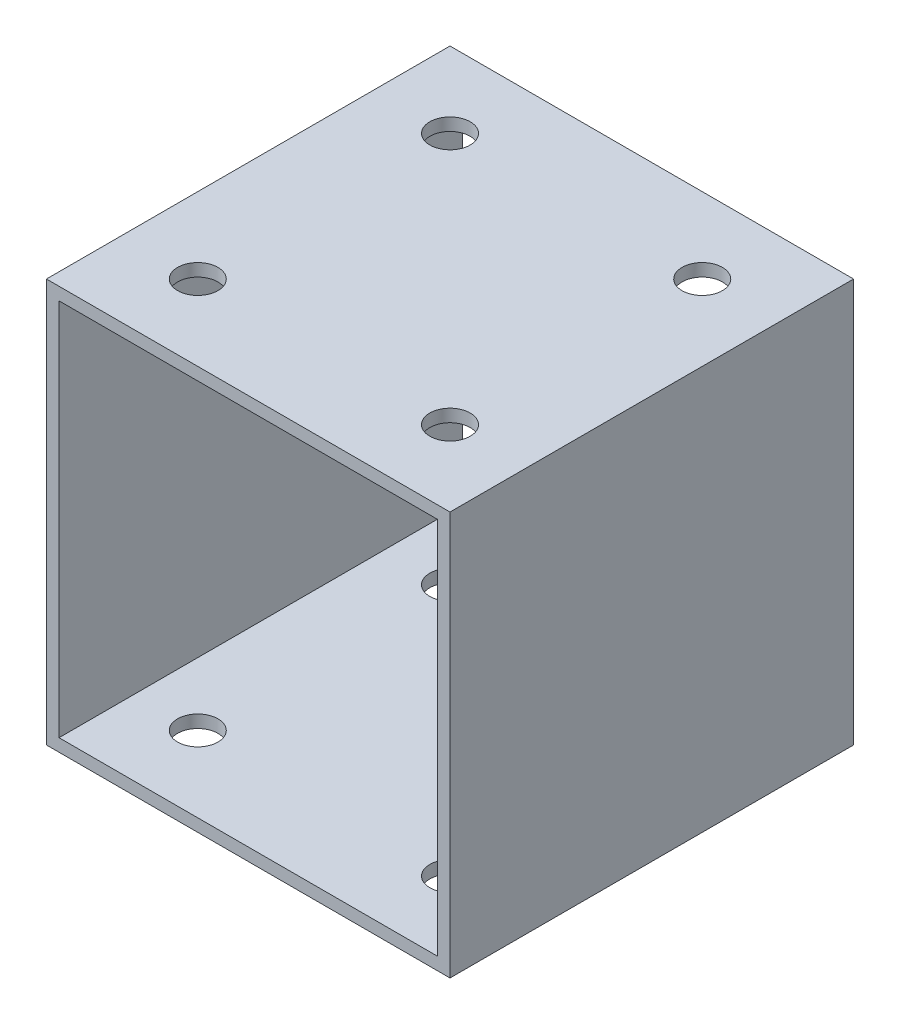
ISO-10303-21;
HEADER;
FILE_DESCRIPTION(('STEP AP214'),'2;1');
FILE_NAME('part.step','',(''),(''),'','','');
FILE_SCHEMA(('AUTOMOTIVE_DESIGN { 1 0 10303 214 1 1 1 1 }'));
ENDSEC;
DATA;
#1=APPLICATION_CONTEXT('core data for automotive mechanical design processes');
#2=APPLICATION_PROTOCOL_DEFINITION('international standard','automotive_design',2000,#1);
#3=PRODUCT_CONTEXT('',#1,'mechanical');
#4=PRODUCT('Part','Part','',(#3));
#5=PRODUCT_RELATED_PRODUCT_CATEGORY('part','',(#4));
#6=PRODUCT_DEFINITION_FORMATION('','',#4);
#7=PRODUCT_DEFINITION_CONTEXT('part definition',#1,'design');
#8=PRODUCT_DEFINITION('design','',#6,#7);
#9=PRODUCT_DEFINITION_SHAPE('','',#8);
#10=(LENGTH_UNIT() NAMED_UNIT(*) SI_UNIT(.MILLI.,.METRE.));
#11=(NAMED_UNIT(*) PLANE_ANGLE_UNIT() SI_UNIT($,.RADIAN.));
#12=(NAMED_UNIT(*) SI_UNIT($,.STERADIAN.) SOLID_ANGLE_UNIT());
#13=UNCERTAINTY_MEASURE_WITH_UNIT(LENGTH_MEASURE(1.E-05),#10,'distance_accuracy_value','');
#14=(GEOMETRIC_REPRESENTATION_CONTEXT(3) GLOBAL_UNCERTAINTY_ASSIGNED_CONTEXT((#13)) GLOBAL_UNIT_ASSIGNED_CONTEXT((#10,
#11,#12)) REPRESENTATION_CONTEXT('',''));
#15=CARTESIAN_POINT('',(0.,0.,0.));
#16=DIRECTION('',(0.,0.,1.));
#17=DIRECTION('',(1.,0.,0.));
#18=AXIS2_PLACEMENT_3D('',#15,#16,#17);
#19=CARTESIAN_POINT('',(0.,0.,50.8));
#20=DIRECTION('',(0.,0.,-1.));
#21=DIRECTION('',(-1.,0.,0.));
#22=AXIS2_PLACEMENT_3D('',#19,#20,#21);
#23=PLANE('',#22);
#24=DIRECTION('',(0.,-1.,0.));
#25=VECTOR('',#24,1.);
#26=CARTESIAN_POINT('',(0.,0.,50.8));
#27=LINE('',#26,#25);
#28=CARTESIAN_POINT('',(0.,50.8,50.8));
#29=VERTEX_POINT('',#28);
#30=CARTESIAN_POINT('',(0.,0.,50.8));
#31=VERTEX_POINT('',#30);
#32=EDGE_CURVE('E139',#29,#31,#27,.T.);
#33=ORIENTED_EDGE('',*,*,#32,.T.);
#34=DIRECTION('',(1.,0.,0.));
#35=VECTOR('',#34,1.);
#36=CARTESIAN_POINT('',(0.,0.,50.8));
#37=LINE('',#36,#35);
#38=CARTESIAN_POINT('',(50.8,0.,50.8));
#39=VERTEX_POINT('',#38);
#40=EDGE_CURVE('E142',#31,#39,#37,.T.);
#41=ORIENTED_EDGE('',*,*,#40,.T.);
#42=DIRECTION('',(0.,1.,0.));
#43=VECTOR('',#42,1.);
#44=CARTESIAN_POINT('',(50.8,0.,50.8));
#45=LINE('',#44,#43);
#46=CARTESIAN_POINT('',(50.8,50.8,50.8));
#47=VERTEX_POINT('',#46);
#48=EDGE_CURVE('E145',#39,#47,#45,.T.);
#49=ORIENTED_EDGE('',*,*,#48,.T.);
#50=DIRECTION('',(-1.,0.,0.));
#51=VECTOR('',#50,1.);
#52=CARTESIAN_POINT('',(0.,50.8,50.8));
#53=LINE('',#52,#51);
#54=EDGE_CURVE('E147',#47,#29,#53,.T.);
#55=ORIENTED_EDGE('',*,*,#54,.T.);
#56=EDGE_LOOP('',(#33,#41,#49,#55));
#57=FACE_BOUND('',#56,.T.);
#58=DIRECTION('',(0.,-1.,0.));
#59=VECTOR('',#58,1.);
#60=CARTESIAN_POINT('',(1.5875,1.5875,50.8));
#61=LINE('',#60,#59);
#62=CARTESIAN_POINT('',(1.5875,49.2125,50.8));
#63=VERTEX_POINT('',#62);
#64=CARTESIAN_POINT('',(1.5875,1.5875,50.8));
#65=VERTEX_POINT('',#64);
#66=EDGE_CURVE('E101',#63,#65,#61,.T.);
#67=ORIENTED_EDGE('',*,*,#66,.F.);
#68=DIRECTION('',(-1.,0.,0.));
#69=VECTOR('',#68,1.);
#70=CARTESIAN_POINT('',(1.5875,49.2125,50.8));
#71=LINE('',#70,#69);
#72=CARTESIAN_POINT('',(49.2125,49.2125,50.8));
#73=VERTEX_POINT('',#72);
#74=EDGE_CURVE('E123',#73,#63,#71,.T.);
#75=ORIENTED_EDGE('',*,*,#74,.F.);
#76=DIRECTION('',(0.,1.,0.));
#77=VECTOR('',#76,1.);
#78=CARTESIAN_POINT('',(49.2125,1.5875,50.8));
#79=LINE('',#78,#77);
#80=CARTESIAN_POINT('',(49.2125,1.5875,50.8));
#81=VERTEX_POINT('',#80);
#82=EDGE_CURVE('E121',#81,#73,#79,.T.);
#83=ORIENTED_EDGE('',*,*,#82,.F.);
#84=DIRECTION('',(1.,0.,0.));
#85=VECTOR('',#84,1.);
#86=CARTESIAN_POINT('',(1.5875,1.5875,50.8));
#87=LINE('',#86,#85);
#88=EDGE_CURVE('E109',#65,#81,#87,.T.);
#89=ORIENTED_EDGE('',*,*,#88,.F.);
#90=EDGE_LOOP('',(#67,#75,#83,#89));
#91=FACE_BOUND('',#90,.T.);
#92=ADVANCED_FACE('F34',(#57,#91),#23,.F.);
#93=CARTESIAN_POINT('',(0.,0.,0.));
#94=DIRECTION('',(0.,0.,-1.));
#95=DIRECTION('',(-1.,0.,0.));
#96=AXIS2_PLACEMENT_3D('',#93,#94,#95);
#97=PLANE('',#96);
#98=DIRECTION('',(0.,-1.,0.));
#99=VECTOR('',#98,1.);
#100=CARTESIAN_POINT('',(0.,0.,0.));
#101=LINE('',#100,#99);
#102=CARTESIAN_POINT('',(0.,50.8,0.));
#103=VERTEX_POINT('',#102);
#104=CARTESIAN_POINT('',(0.,0.,0.));
#105=VERTEX_POINT('',#104);
#106=EDGE_CURVE('E117',#103,#105,#101,.T.);
#107=ORIENTED_EDGE('',*,*,#106,.F.);
#108=DIRECTION('',(-1.,0.,0.));
#109=VECTOR('',#108,1.);
#110=CARTESIAN_POINT('',(0.,50.8,0.));
#111=LINE('',#110,#109);
#112=CARTESIAN_POINT('',(50.8,50.8,0.));
#113=VERTEX_POINT('',#112);
#114=EDGE_CURVE('E143',#113,#103,#111,.T.);
#115=ORIENTED_EDGE('',*,*,#114,.F.);
#116=DIRECTION('',(0.,1.,0.));
#117=VECTOR('',#116,1.);
#118=CARTESIAN_POINT('',(50.8,0.,0.));
#119=LINE('',#118,#117);
#120=CARTESIAN_POINT('',(50.8,0.,0.));
#121=VERTEX_POINT('',#120);
#122=EDGE_CURVE('E154',#121,#113,#119,.T.);
#123=ORIENTED_EDGE('',*,*,#122,.F.);
#124=DIRECTION('',(1.,0.,0.));
#125=VECTOR('',#124,1.);
#126=CARTESIAN_POINT('',(0.,0.,0.));
#127=LINE('',#126,#125);
#128=EDGE_CURVE('E152',#105,#121,#127,.T.);
#129=ORIENTED_EDGE('',*,*,#128,.F.);
#130=EDGE_LOOP('',(#107,#115,#123,#129));
#131=FACE_BOUND('',#130,.T.);
#132=DIRECTION('',(-1.,0.,0.));
#133=VECTOR('',#132,1.);
#134=CARTESIAN_POINT('',(1.5875,49.2125,0.));
#135=LINE('',#134,#133);
#136=CARTESIAN_POINT('',(49.2125,49.2125,0.));
#137=VERTEX_POINT('',#136);
#138=CARTESIAN_POINT('',(1.5875,49.2125,0.));
#139=VERTEX_POINT('',#138);
#140=EDGE_CURVE('E110',#137,#139,#135,.T.);
#141=ORIENTED_EDGE('',*,*,#140,.T.);
#142=DIRECTION('',(0.,-1.,0.));
#143=VECTOR('',#142,1.);
#144=CARTESIAN_POINT('',(1.5875,1.5875,0.));
#145=LINE('',#144,#143);
#146=CARTESIAN_POINT('',(1.5875,1.5875,0.));
#147=VERTEX_POINT('',#146);
#148=EDGE_CURVE('E59',#139,#147,#145,.T.);
#149=ORIENTED_EDGE('',*,*,#148,.T.);
#150=DIRECTION('',(1.,0.,0.));
#151=VECTOR('',#150,1.);
#152=CARTESIAN_POINT('',(1.5875,1.5875,0.));
#153=LINE('',#152,#151);
#154=CARTESIAN_POINT('',(49.2125,1.5875,0.));
#155=VERTEX_POINT('',#154);
#156=EDGE_CURVE('E116',#147,#155,#153,.T.);
#157=ORIENTED_EDGE('',*,*,#156,.T.);
#158=DIRECTION('',(0.,1.,0.));
#159=VECTOR('',#158,1.);
#160=CARTESIAN_POINT('',(49.2125,1.5875,0.));
#161=LINE('',#160,#159);
#162=EDGE_CURVE('E131',#155,#137,#161,.T.);
#163=ORIENTED_EDGE('',*,*,#162,.T.);
#164=EDGE_LOOP('',(#141,#149,#157,#163));
#165=FACE_BOUND('',#164,.T.);
#166=ADVANCED_FACE('F206',(#131,#165),#97,.T.);
#167=CARTESIAN_POINT('',(0.,0.,50.8));
#168=DIRECTION('',(1.,0.,0.));
#169=DIRECTION('',(0.,0.,-1.));
#170=AXIS2_PLACEMENT_3D('',#167,#168,#169);
#171=PLANE('',#170);
#172=ORIENTED_EDGE('',*,*,#106,.T.);
#173=DIRECTION('',(0.,0.,-1.));
#174=VECTOR('',#173,1.);
#175=CARTESIAN_POINT('',(0.,0.,50.8));
#176=LINE('',#175,#174);
#177=EDGE_CURVE('E11',#31,#105,#176,.T.);
#178=ORIENTED_EDGE('',*,*,#177,.F.);
#179=ORIENTED_EDGE('',*,*,#32,.F.);
#180=DIRECTION('',(0.,0.,-1.));
#181=VECTOR('',#180,1.);
#182=CARTESIAN_POINT('',(0.,50.8,50.8));
#183=LINE('',#182,#181);
#184=EDGE_CURVE('E149',#29,#103,#183,.T.);
#185=ORIENTED_EDGE('',*,*,#184,.T.);
#186=EDGE_LOOP('',(#172,#178,#179,#185));
#187=FACE_BOUND('',#186,.T.);
#188=ADVANCED_FACE('F36',(#187),#171,.F.);
#189=CARTESIAN_POINT('',(0.,0.,50.8));
#190=DIRECTION('',(0.,1.,0.));
#191=DIRECTION('',(0.,0.,1.));
#192=AXIS2_PLACEMENT_3D('',#189,#190,#191);
#193=PLANE('',#192);
#194=CARTESIAN_POINT('',(41.275,0.,41.275));
#195=DIRECTION('',(0.,1.,0.));
#196=DIRECTION('',(0.,0.,1.));
#197=AXIS2_PLACEMENT_3D('',#194,#195,#196);
#198=CIRCLE('',#197,2.54);
#199=CARTESIAN_POINT('',(41.275,0.,43.815));
#200=VERTEX_POINT('',#199);
#201=EDGE_CURVE('E242',#200,#200,#198,.T.);
#202=ORIENTED_EDGE('',*,*,#201,.T.);
#203=EDGE_LOOP('',(#202));
#204=FACE_BOUND('',#203,.T.);
#205=CARTESIAN_POINT('',(9.525,0.,9.525));
#206=DIRECTION('',(0.,1.,0.));
#207=DIRECTION('',(0.,0.,1.));
#208=AXIS2_PLACEMENT_3D('',#205,#206,#207);
#209=CIRCLE('',#208,2.54);
#210=CARTESIAN_POINT('',(9.525,0.,12.065));
#211=VERTEX_POINT('',#210);
#212=EDGE_CURVE('E246',#211,#211,#209,.T.);
#213=ORIENTED_EDGE('',*,*,#212,.T.);
#214=EDGE_LOOP('',(#213));
#215=FACE_BOUND('',#214,.T.);
#216=CARTESIAN_POINT('',(9.525,0.,41.275));
#217=DIRECTION('',(0.,1.,0.));
#218=DIRECTION('',(0.,0.,1.));
#219=AXIS2_PLACEMENT_3D('',#216,#217,#218);
#220=CIRCLE('',#219,2.54);
#221=CARTESIAN_POINT('',(9.525,0.,43.815));
#222=VERTEX_POINT('',#221);
#223=EDGE_CURVE('E250',#222,#222,#220,.T.);
#224=ORIENTED_EDGE('',*,*,#223,.T.);
#225=EDGE_LOOP('',(#224));
#226=FACE_BOUND('',#225,.T.);
#227=CARTESIAN_POINT('',(41.275,0.,9.525));
#228=DIRECTION('',(0.,1.,0.));
#229=DIRECTION('',(0.,0.,1.));
#230=AXIS2_PLACEMENT_3D('',#227,#228,#229);
#231=CIRCLE('',#230,2.54);
#232=CARTESIAN_POINT('',(41.275,0.,12.065));
#233=VERTEX_POINT('',#232);
#234=EDGE_CURVE('E168',#233,#233,#231,.T.);
#235=ORIENTED_EDGE('',*,*,#234,.T.);
#236=EDGE_LOOP('',(#235));
#237=FACE_BOUND('',#236,.T.);
#238=ORIENTED_EDGE('',*,*,#128,.T.);
#239=DIRECTION('',(0.,0.,-1.));
#240=VECTOR('',#239,1.);
#241=CARTESIAN_POINT('',(50.8,0.,50.8));
#242=LINE('',#241,#240);
#243=EDGE_CURVE('E43',#39,#121,#242,.T.);
#244=ORIENTED_EDGE('',*,*,#243,.F.);
#245=ORIENTED_EDGE('',*,*,#40,.F.);
#246=ORIENTED_EDGE('',*,*,#177,.T.);
#247=EDGE_LOOP('',(#238,#244,#245,#246));
#248=FACE_BOUND('',#247,.T.);
#249=ADVANCED_FACE('F231',(#204,#215,#226,#237,#248),#193,.F.);
#250=CARTESIAN_POINT('',(50.8,0.,50.8));
#251=DIRECTION('',(-1.,0.,0.));
#252=DIRECTION('',(0.,0.,1.));
#253=AXIS2_PLACEMENT_3D('',#250,#251,#252);
#254=PLANE('',#253);
#255=ORIENTED_EDGE('',*,*,#122,.T.);
#256=DIRECTION('',(0.,0.,-1.));
#257=VECTOR('',#256,1.);
#258=CARTESIAN_POINT('',(50.8,50.8,50.8));
#259=LINE('',#258,#257);
#260=EDGE_CURVE('E159',#47,#113,#259,.T.);
#261=ORIENTED_EDGE('',*,*,#260,.F.);
#262=ORIENTED_EDGE('',*,*,#48,.F.);
#263=ORIENTED_EDGE('',*,*,#243,.T.);
#264=EDGE_LOOP('',(#255,#261,#262,#263));
#265=FACE_BOUND('',#264,.T.);
#266=ADVANCED_FACE('F228',(#265),#254,.F.);
#267=CARTESIAN_POINT('',(0.,50.8,50.8));
#268=DIRECTION('',(0.,-1.,0.));
#269=DIRECTION('',(0.,0.,-1.));
#270=AXIS2_PLACEMENT_3D('',#267,#268,#269);
#271=PLANE('',#270);
#272=CARTESIAN_POINT('',(41.275,50.8,41.275));
#273=DIRECTION('',(0.,1.,0.));
#274=DIRECTION('',(0.,0.,1.));
#275=AXIS2_PLACEMENT_3D('',#272,#273,#274);
#276=CIRCLE('',#275,2.54);
#277=CARTESIAN_POINT('',(41.275,50.8,43.815));
#278=VERTEX_POINT('',#277);
#279=EDGE_CURVE('E274',#278,#278,#276,.T.);
#280=ORIENTED_EDGE('',*,*,#279,.F.);
#281=EDGE_LOOP('',(#280));
#282=FACE_BOUND('',#281,.T.);
#283=CARTESIAN_POINT('',(9.525,50.8,9.525));
#284=DIRECTION('',(0.,1.,0.));
#285=DIRECTION('',(0.,0.,1.));
#286=AXIS2_PLACEMENT_3D('',#283,#284,#285);
#287=CIRCLE('',#286,2.54);
#288=CARTESIAN_POINT('',(9.525,50.8,12.065));
#289=VERTEX_POINT('',#288);
#290=EDGE_CURVE('E270',#289,#289,#287,.T.);
#291=ORIENTED_EDGE('',*,*,#290,.F.);
#292=EDGE_LOOP('',(#291));
#293=FACE_BOUND('',#292,.T.);
#294=CARTESIAN_POINT('',(9.525,50.8,41.275));
#295=DIRECTION('',(0.,1.,0.));
#296=DIRECTION('',(0.,0.,1.));
#297=AXIS2_PLACEMENT_3D('',#294,#295,#296);
#298=CIRCLE('',#297,2.54);
#299=CARTESIAN_POINT('',(9.525,50.8,43.815));
#300=VERTEX_POINT('',#299);
#301=EDGE_CURVE('E278',#300,#300,#298,.T.);
#302=ORIENTED_EDGE('',*,*,#301,.F.);
#303=EDGE_LOOP('',(#302));
#304=FACE_BOUND('',#303,.T.);
#305=CARTESIAN_POINT('',(41.275,50.8,9.525));
#306=DIRECTION('',(0.,1.,0.));
#307=DIRECTION('',(0.,0.,1.));
#308=AXIS2_PLACEMENT_3D('',#305,#306,#307);
#309=CIRCLE('',#308,2.54);
#310=CARTESIAN_POINT('',(41.275,50.8,12.065));
#311=VERTEX_POINT('',#310);
#312=EDGE_CURVE('E266',#311,#311,#309,.T.);
#313=ORIENTED_EDGE('',*,*,#312,.F.);
#314=EDGE_LOOP('',(#313));
#315=FACE_BOUND('',#314,.T.);
#316=ORIENTED_EDGE('',*,*,#114,.T.);
#317=ORIENTED_EDGE('',*,*,#184,.F.);
#318=ORIENTED_EDGE('',*,*,#54,.F.);
#319=ORIENTED_EDGE('',*,*,#260,.T.);
#320=EDGE_LOOP('',(#316,#317,#318,#319));
#321=FACE_BOUND('',#320,.T.);
#322=ADVANCED_FACE('F225',(#282,#293,#304,#315,#321),#271,.F.);
#323=CARTESIAN_POINT('',(1.5875,1.5875,50.8));
#324=DIRECTION('',(1.,0.,0.));
#325=DIRECTION('',(0.,0.,-1.));
#326=AXIS2_PLACEMENT_3D('',#323,#324,#325);
#327=PLANE('',#326);
#328=ORIENTED_EDGE('',*,*,#148,.F.);
#329=DIRECTION('',(0.,0.,-1.));
#330=VECTOR('',#329,1.);
#331=CARTESIAN_POINT('',(1.5875,49.2125,50.8));
#332=LINE('',#331,#330);
#333=EDGE_CURVE('E105',#63,#139,#332,.T.);
#334=ORIENTED_EDGE('',*,*,#333,.F.);
#335=ORIENTED_EDGE('',*,*,#66,.T.);
#336=DIRECTION('',(0.,0.,-1.));
#337=VECTOR('',#336,1.);
#338=CARTESIAN_POINT('',(1.5875,1.5875,50.8));
#339=LINE('',#338,#337);
#340=EDGE_CURVE('E104',#65,#147,#339,.T.);
#341=ORIENTED_EDGE('',*,*,#340,.T.);
#342=EDGE_LOOP('',(#328,#334,#335,#341));
#343=FACE_BOUND('',#342,.T.);
#344=ADVANCED_FACE('F103',(#343),#327,.T.);
#345=CARTESIAN_POINT('',(1.5875,1.5875,50.8));
#346=DIRECTION('',(0.,1.,0.));
#347=DIRECTION('',(0.,0.,1.));
#348=AXIS2_PLACEMENT_3D('',#345,#346,#347);
#349=PLANE('',#348);
#350=CARTESIAN_POINT('',(41.275,1.5875,41.275));
#351=DIRECTION('',(0.,1.,0.));
#352=DIRECTION('',(0.,0.,1.));
#353=AXIS2_PLACEMENT_3D('',#350,#351,#352);
#354=CIRCLE('',#353,2.54);
#355=CARTESIAN_POINT('',(41.275,1.5875,43.815));
#356=VERTEX_POINT('',#355);
#357=EDGE_CURVE('E129',#356,#356,#354,.T.);
#358=ORIENTED_EDGE('',*,*,#357,.F.);
#359=EDGE_LOOP('',(#358));
#360=FACE_BOUND('',#359,.T.);
#361=CARTESIAN_POINT('',(9.525,1.5875,9.525));
#362=DIRECTION('',(0.,1.,0.));
#363=DIRECTION('',(0.,0.,1.));
#364=AXIS2_PLACEMENT_3D('',#361,#362,#363);
#365=CIRCLE('',#364,2.54);
#366=CARTESIAN_POINT('',(9.525,1.5875,12.065));
#367=VERTEX_POINT('',#366);
#368=EDGE_CURVE('E174',#367,#367,#365,.T.);
#369=ORIENTED_EDGE('',*,*,#368,.F.);
#370=EDGE_LOOP('',(#369));
#371=FACE_BOUND('',#370,.T.);
#372=CARTESIAN_POINT('',(9.525,1.5875,41.275));
#373=DIRECTION('',(0.,1.,0.));
#374=DIRECTION('',(0.,0.,1.));
#375=AXIS2_PLACEMENT_3D('',#372,#373,#374);
#376=CIRCLE('',#375,2.54);
#377=CARTESIAN_POINT('',(9.525,1.5875,43.815));
#378=VERTEX_POINT('',#377);
#379=EDGE_CURVE('E171',#378,#378,#376,.T.);
#380=ORIENTED_EDGE('',*,*,#379,.F.);
#381=EDGE_LOOP('',(#380));
#382=FACE_BOUND('',#381,.T.);
#383=CARTESIAN_POINT('',(41.275,1.5875,9.525));
#384=DIRECTION('',(0.,1.,0.));
#385=DIRECTION('',(0.,0.,1.));
#386=AXIS2_PLACEMENT_3D('',#383,#384,#385);
#387=CIRCLE('',#386,2.54);
#388=CARTESIAN_POINT('',(41.275,1.5875,12.065));
#389=VERTEX_POINT('',#388);
#390=EDGE_CURVE('E167',#389,#389,#387,.T.);
#391=ORIENTED_EDGE('',*,*,#390,.F.);
#392=EDGE_LOOP('',(#391));
#393=FACE_BOUND('',#392,.T.);
#394=ORIENTED_EDGE('',*,*,#156,.F.);
#395=ORIENTED_EDGE('',*,*,#340,.F.);
#396=ORIENTED_EDGE('',*,*,#88,.T.);
#397=DIRECTION('',(0.,0.,-1.));
#398=VECTOR('',#397,1.);
#399=CARTESIAN_POINT('',(49.2125,1.5875,50.8));
#400=LINE('',#399,#398);
#401=EDGE_CURVE('E118',#81,#155,#400,.T.);
#402=ORIENTED_EDGE('',*,*,#401,.T.);
#403=EDGE_LOOP('',(#394,#395,#396,#402));
#404=FACE_BOUND('',#403,.T.);
#405=ADVANCED_FACE('F113',(#360,#371,#382,#393,#404),#349,.T.);
#406=CARTESIAN_POINT('',(49.2125,1.5875,50.8));
#407=DIRECTION('',(-1.,0.,0.));
#408=DIRECTION('',(0.,0.,1.));
#409=AXIS2_PLACEMENT_3D('',#406,#407,#408);
#410=PLANE('',#409);
#411=ORIENTED_EDGE('',*,*,#162,.F.);
#412=ORIENTED_EDGE('',*,*,#401,.F.);
#413=ORIENTED_EDGE('',*,*,#82,.T.);
#414=DIRECTION('',(0.,0.,-1.));
#415=VECTOR('',#414,1.);
#416=CARTESIAN_POINT('',(49.2125,49.2125,50.8));
#417=LINE('',#416,#415);
#418=EDGE_CURVE('E51',#73,#137,#417,.T.);
#419=ORIENTED_EDGE('',*,*,#418,.T.);
#420=EDGE_LOOP('',(#411,#412,#413,#419));
#421=FACE_BOUND('',#420,.T.);
#422=ADVANCED_FACE('F198',(#421),#410,.T.);
#423=CARTESIAN_POINT('',(1.5875,49.2125,50.8));
#424=DIRECTION('',(0.,-1.,0.));
#425=DIRECTION('',(0.,0.,-1.));
#426=AXIS2_PLACEMENT_3D('',#423,#424,#425);
#427=PLANE('',#426);
#428=CARTESIAN_POINT('',(41.275,49.2125,41.275));
#429=DIRECTION('',(0.,-1.,0.));
#430=DIRECTION('',(0.,0.,-1.));
#431=AXIS2_PLACEMENT_3D('',#428,#429,#430);
#432=CIRCLE('',#431,2.54);
#433=CARTESIAN_POINT('',(41.275,49.2125,38.735));
#434=VERTEX_POINT('',#433);
#435=EDGE_CURVE('E38',#434,#434,#432,.T.);
#436=ORIENTED_EDGE('',*,*,#435,.F.);
#437=EDGE_LOOP('',(#436));
#438=FACE_BOUND('',#437,.T.);
#439=CARTESIAN_POINT('',(9.525,49.2125,9.525));
#440=DIRECTION('',(0.,-1.,0.));
#441=DIRECTION('',(0.,0.,-1.));
#442=AXIS2_PLACEMENT_3D('',#439,#440,#441);
#443=CIRCLE('',#442,2.54);
#444=CARTESIAN_POINT('',(9.525,49.2125,6.985));
#445=VERTEX_POINT('',#444);
#446=EDGE_CURVE('E172',#445,#445,#443,.T.);
#447=ORIENTED_EDGE('',*,*,#446,.F.);
#448=EDGE_LOOP('',(#447));
#449=FACE_BOUND('',#448,.T.);
#450=CARTESIAN_POINT('',(9.525,49.2125,41.275));
#451=DIRECTION('',(0.,-1.,0.));
#452=DIRECTION('',(0.,0.,-1.));
#453=AXIS2_PLACEMENT_3D('',#450,#451,#452);
#454=CIRCLE('',#453,2.54);
#455=CARTESIAN_POINT('',(9.525,49.2125,38.735));
#456=VERTEX_POINT('',#455);
#457=EDGE_CURVE('E169',#456,#456,#454,.T.);
#458=ORIENTED_EDGE('',*,*,#457,.F.);
#459=EDGE_LOOP('',(#458));
#460=FACE_BOUND('',#459,.T.);
#461=CARTESIAN_POINT('',(41.275,49.2125,9.525));
#462=DIRECTION('',(0.,-1.,0.));
#463=DIRECTION('',(0.,0.,-1.));
#464=AXIS2_PLACEMENT_3D('',#461,#462,#463);
#465=CIRCLE('',#464,2.54);
#466=CARTESIAN_POINT('',(41.275,49.2125,6.985));
#467=VERTEX_POINT('',#466);
#468=EDGE_CURVE('E164',#467,#467,#465,.T.);
#469=ORIENTED_EDGE('',*,*,#468,.F.);
#470=EDGE_LOOP('',(#469));
#471=FACE_BOUND('',#470,.T.);
#472=ORIENTED_EDGE('',*,*,#140,.F.);
#473=ORIENTED_EDGE('',*,*,#418,.F.);
#474=ORIENTED_EDGE('',*,*,#74,.T.);
#475=ORIENTED_EDGE('',*,*,#333,.T.);
#476=EDGE_LOOP('',(#472,#473,#474,#475));
#477=FACE_BOUND('',#476,.T.);
#478=ADVANCED_FACE('F194',(#438,#449,#460,#471,#477),#427,.T.);
#479=CARTESIAN_POINT('',(41.275,0.,9.525));
#480=DIRECTION('',(0.,1.,0.));
#481=DIRECTION('',(0.,0.,1.));
#482=AXIS2_PLACEMENT_3D('',#479,#480,#481);
#483=CYLINDRICAL_SURFACE('',#482,2.54);
#484=ORIENTED_EDGE('',*,*,#468,.T.);
#485=EDGE_LOOP('',(#484));
#486=FACE_BOUND('',#485,.T.);
#487=ORIENTED_EDGE('',*,*,#312,.T.);
#488=EDGE_LOOP('',(#487));
#489=FACE_BOUND('',#488,.T.);
#490=ADVANCED_FACE('F197',(#486,#489),#483,.F.);
#491=CARTESIAN_POINT('',(9.525,0.,41.275));
#492=DIRECTION('',(0.,1.,0.));
#493=DIRECTION('',(0.,0.,1.));
#494=AXIS2_PLACEMENT_3D('',#491,#492,#493);
#495=CYLINDRICAL_SURFACE('',#494,2.54);
#496=ORIENTED_EDGE('',*,*,#457,.T.);
#497=EDGE_LOOP('',(#496));
#498=FACE_BOUND('',#497,.T.);
#499=ORIENTED_EDGE('',*,*,#301,.T.);
#500=EDGE_LOOP('',(#499));
#501=FACE_BOUND('',#500,.T.);
#502=ADVANCED_FACE('F283',(#498,#501),#495,.F.);
#503=CARTESIAN_POINT('',(9.525,0.,9.525));
#504=DIRECTION('',(0.,1.,0.));
#505=DIRECTION('',(0.,0.,1.));
#506=AXIS2_PLACEMENT_3D('',#503,#504,#505);
#507=CYLINDRICAL_SURFACE('',#506,2.54);
#508=ORIENTED_EDGE('',*,*,#446,.T.);
#509=EDGE_LOOP('',(#508));
#510=FACE_BOUND('',#509,.T.);
#511=ORIENTED_EDGE('',*,*,#290,.T.);
#512=EDGE_LOOP('',(#511));
#513=FACE_BOUND('',#512,.T.);
#514=ADVANCED_FACE('F295',(#510,#513),#507,.F.);
#515=CARTESIAN_POINT('',(41.275,0.,41.275));
#516=DIRECTION('',(0.,1.,0.));
#517=DIRECTION('',(0.,0.,1.));
#518=AXIS2_PLACEMENT_3D('',#515,#516,#517);
#519=CYLINDRICAL_SURFACE('',#518,2.54);
#520=ORIENTED_EDGE('',*,*,#435,.T.);
#521=EDGE_LOOP('',(#520));
#522=FACE_BOUND('',#521,.T.);
#523=ORIENTED_EDGE('',*,*,#279,.T.);
#524=EDGE_LOOP('',(#523));
#525=FACE_BOUND('',#524,.T.);
#526=ADVANCED_FACE('F191',(#522,#525),#519,.F.);
#527=ORIENTED_EDGE('',*,*,#390,.T.);
#528=EDGE_LOOP('',(#527));
#529=FACE_BOUND('',#528,.T.);
#530=ORIENTED_EDGE('',*,*,#234,.F.);
#531=EDGE_LOOP('',(#530));
#532=FACE_BOUND('',#531,.T.);
#533=ADVANCED_FACE('F291',(#529,#532),#483,.F.);
#534=ORIENTED_EDGE('',*,*,#379,.T.);
#535=EDGE_LOOP('',(#534));
#536=FACE_BOUND('',#535,.T.);
#537=ORIENTED_EDGE('',*,*,#223,.F.);
#538=EDGE_LOOP('',(#537));
#539=FACE_BOUND('',#538,.T.);
#540=ADVANCED_FACE('F298',(#536,#539),#495,.F.);
#541=ORIENTED_EDGE('',*,*,#368,.T.);
#542=EDGE_LOOP('',(#541));
#543=FACE_BOUND('',#542,.T.);
#544=ORIENTED_EDGE('',*,*,#212,.F.);
#545=EDGE_LOOP('',(#544));
#546=FACE_BOUND('',#545,.T.);
#547=ADVANCED_FACE('F306',(#543,#546),#507,.F.);
#548=ORIENTED_EDGE('',*,*,#357,.T.);
#549=EDGE_LOOP('',(#548));
#550=FACE_BOUND('',#549,.T.);
#551=ORIENTED_EDGE('',*,*,#201,.F.);
#552=EDGE_LOOP('',(#551));
#553=FACE_BOUND('',#552,.T.);
#554=ADVANCED_FACE('F308',(#550,#553),#519,.F.);
#555=CLOSED_SHELL('',(#92,#166,#188,#249,#266,#322,#344,#405,#422,#478,#490,#502,#514,#526,#533,
#540,#547,#554));
#556=MANIFOLD_SOLID_BREP('B2',#555);
#557=ADVANCED_BREP_SHAPE_REPRESENTATION('',(#18,#556),#14);
#558=SHAPE_DEFINITION_REPRESENTATION(#9,#557);
ENDSEC;
END-ISO-10303-21;
